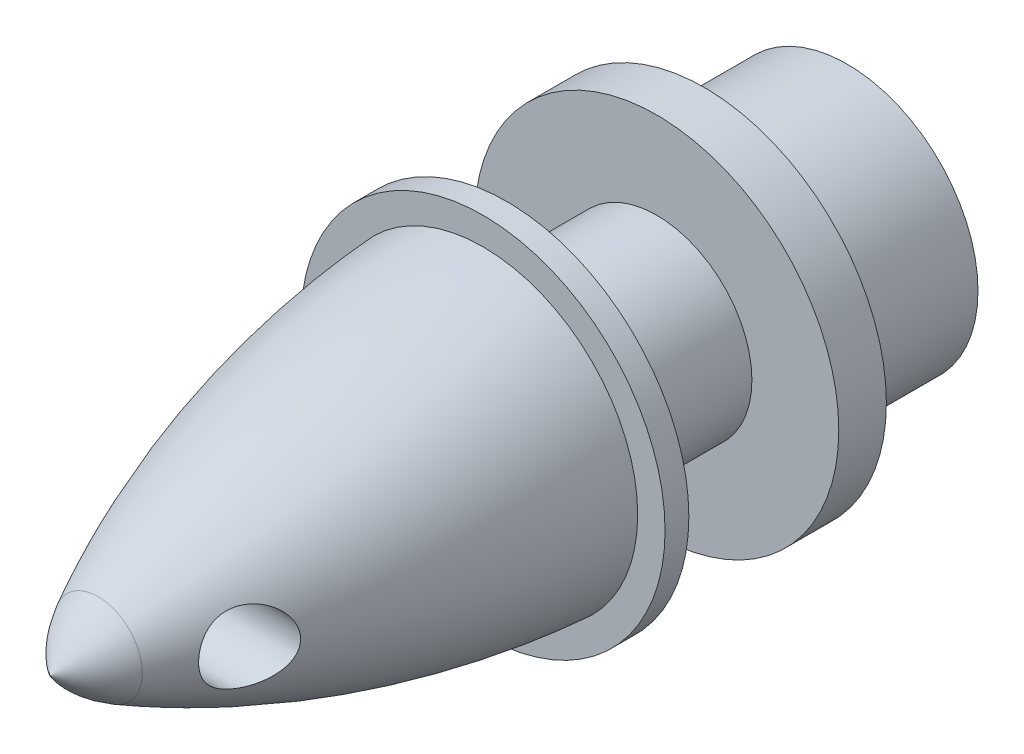
ISO-10303-21;
HEADER;
FILE_DESCRIPTION(('STEP AP214'),'2;1');
FILE_NAME('part.step','',(''),(''),'','','');
FILE_SCHEMA(('AUTOMOTIVE_DESIGN { 1 0 10303 214 1 1 1 1 }'));
ENDSEC;
DATA;
#1=APPLICATION_CONTEXT('core data for automotive mechanical design processes');
#2=APPLICATION_PROTOCOL_DEFINITION('international standard','automotive_design',2000,#1);
#3=PRODUCT_CONTEXT('',#1,'mechanical');
#4=PRODUCT('Part','Part','',(#3));
#5=PRODUCT_RELATED_PRODUCT_CATEGORY('part','',(#4));
#6=PRODUCT_DEFINITION_FORMATION('','',#4);
#7=PRODUCT_DEFINITION_CONTEXT('part definition',#1,'design');
#8=PRODUCT_DEFINITION('design','',#6,#7);
#9=PRODUCT_DEFINITION_SHAPE('','',#8);
#10=(LENGTH_UNIT() NAMED_UNIT(*) SI_UNIT(.MILLI.,.METRE.));
#11=(NAMED_UNIT(*) PLANE_ANGLE_UNIT() SI_UNIT($,.RADIAN.));
#12=(NAMED_UNIT(*) SI_UNIT($,.STERADIAN.) SOLID_ANGLE_UNIT());
#13=UNCERTAINTY_MEASURE_WITH_UNIT(LENGTH_MEASURE(1.E-05),#10,'distance_accuracy_value','');
#14=(GEOMETRIC_REPRESENTATION_CONTEXT(3) GLOBAL_UNCERTAINTY_ASSIGNED_CONTEXT((#13)) GLOBAL_UNIT_ASSIGNED_CONTEXT((#10,
#11,#12)) REPRESENTATION_CONTEXT('',''));
#15=CARTESIAN_POINT('',(0.,0.,0.));
#16=DIRECTION('',(0.,0.,1.));
#17=DIRECTION('',(1.,0.,0.));
#18=AXIS2_PLACEMENT_3D('',#15,#16,#17);
#19=CARTESIAN_POINT('',(-3.,0.,12.1402277713536));
#20=DIRECTION('',(0.,-1.,0.));
#21=DIRECTION('',(1.,0.,0.));
#22=AXIS2_PLACEMENT_3D('',#19,#20,#21);
#23=CIRCLE('',#22,5.5);
#24=TRIMMED_CURVE('',#23,(PARAMETER_VALUE(-0.993864981558439)),
(PARAMETER_VALUE(0.993864981558439)),.T.,.PARAMETER.);
#25=CARTESIAN_POINT('',(0.,0.,12.1402277713536));
#26=DIRECTION('',(0.,0.,1.));
#27=AXIS1_PLACEMENT('',#25,#26);
#28=SURFACE_OF_REVOLUTION('',#24,#27);
#29=CARTESIAN_POINT('',(0.,0.,16.75));
#30=VERTEX_POINT('',#29);
#31=VERTEX_LOOP('',#30);
#32=FACE_BOUND('',#31,.T.);
#33=CARTESIAN_POINT('',(0.,0.,14.7233272084972));
#34=DIRECTION('',(0.,0.,1.));
#35=DIRECTION('',(1.,0.,0.));
#36=AXIS2_PLACEMENT_3D('',#33,#34,#35);
#37=CIRCLE('',#36,1.85567681150921);
#38=CARTESIAN_POINT('',(1.85567681150921,0.,14.7233272084972));
#39=VERTEX_POINT('',#38);
#40=EDGE_CURVE('E11',#39,#39,#37,.T.);
#41=ORIENTED_EDGE('',*,*,#40,.T.);
#42=EDGE_LOOP('',(#41));
#43=FACE_BOUND('',#42,.T.);
#44=ADVANCED_FACE('F35',(#32,#43),#28,.T.);
#45=CARTESIAN_POINT('',(0.,0.,-4.29767773774233));
#46=DIRECTION('',(0.,0.,1.));
#47=DIRECTION('',(1.,0.,0.));
#48=AXIS2_PLACEMENT_3D('',#45,#46,#47);
#49=DEGENERATE_TOROIDAL_SURFACE('',#48,33.8997615277859,40.5,.F.);
#50=CARTESIAN_POINT('',(-3.83034929221141,-0.631541586660031,10.2894283464427));
#51=CARTESIAN_POINT('',(-3.85143952273451,-0.570672683220179,10.2611763089974));
#52=CARTESIAN_POINT('',(-3.86989224051546,-0.507122725607407,10.2366537173003));
#53=CARTESIAN_POINT('',(-3.90042645832149,-0.375845511399598,10.1962280268149));
#54=CARTESIAN_POINT('',(-3.91250825062599,-0.308118446597261,10.1803245326067));
#55=CARTESIAN_POINT('',(-3.92948372047723,-0.169949209156696,10.1580118547172));
#56=CARTESIAN_POINT('',(-3.93435066094763,-0.0994979252108073,10.1516379855454));
#57=CARTESIAN_POINT('',(-3.93642523613772,0.0417032275088749,10.1489187705136));
#58=CARTESIAN_POINT('',(-3.93363435637182,0.112453035714549,10.152571479632));
#59=CARTESIAN_POINT('',(-3.92091880482957,0.248865646072327,10.1692649127013));
#60=CARTESIAN_POINT('',(-3.91132300015463,0.314613708351748,10.1818728912772));
#61=CARTESIAN_POINT('',(-3.88600647401792,0.442738806364672,10.2152979421072));
#62=CARTESIAN_POINT('',(-3.87028420247205,0.505114984411245,10.2361170919217));
#63=CARTESIAN_POINT('',(-3.83258987861195,0.628663684945975,10.2863733390065));
#64=CARTESIAN_POINT('',(-3.81031671271832,0.689572404029732,10.3162283559207));
#65=CARTESIAN_POINT('',(-3.76111263800261,0.805430578032693,10.3828168021825));
#66=CARTESIAN_POINT('',(-3.7341795547332,0.860377231321946,10.4195534433523));
#67=CARTESIAN_POINT('',(-3.67198392315347,0.972483019063366,10.5054220657219));
#68=CARTESIAN_POINT('',(-3.63608130261267,1.02848384216901,10.5555994816793));
#69=CARTESIAN_POINT('',(-3.56105196490299,1.13143088982405,10.6623898652515));
#70=CARTESIAN_POINT('',(-3.52192331745678,1.17837163637791,10.7190066936586));
#71=CARTESIAN_POINT('',(-3.43390110720227,1.27144147401707,10.8493397208757));
#72=CARTESIAN_POINT('',(-3.38460861200144,1.31556782784547,10.9242215045879));
#73=CARTESIAN_POINT('',(-3.28557287666364,1.39030144153474,11.0802973035003));
#74=CARTESIAN_POINT('',(-3.23582912043691,1.42089048084012,11.1614996541664));
#75=CARTESIAN_POINT('',(-3.13244570670288,1.47055978389585,11.3387389669955));
#76=CARTESIAN_POINT('',(-3.07902399627282,1.48789215928985,11.4354038128141));
#77=CARTESIAN_POINT('',(-2.97784381126411,1.50316354366147,11.6331098754129));
#78=CARTESIAN_POINT('',(-2.93007511663219,1.50113810903036,11.7341427292247));
#79=CARTESIAN_POINT('',(-2.85523939960039,1.47912107896708,11.9105198726158));
#80=CARTESIAN_POINT('',(-2.82604107814951,1.46403311319761,11.9855760714478));
#81=CARTESIAN_POINT('',(-2.77391645839891,1.4217248943525,12.1344243876945));
#82=CARTESIAN_POINT('',(-2.75098351273744,1.39451758079328,12.2082177663631));
#83=CARTESIAN_POINT('',(-2.71198918457917,1.32779505922188,12.3523431996062));
#84=CARTESIAN_POINT('',(-2.69595385564735,1.28823414329281,12.42266125775));
#85=CARTESIAN_POINT('',(-2.67059327723959,1.19759936832161,12.5568123955501));
#86=CARTESIAN_POINT('',(-2.66126988195264,1.14652233303524,12.6206436790388));
#87=CARTESIAN_POINT('',(-2.64843361231305,1.03751902183787,12.7360487241476));
#88=CARTESIAN_POINT('',(-2.64462310528447,0.98014039582493,12.7881103149015));
#89=CARTESIAN_POINT('',(-2.64029305502329,0.857977972759712,12.8828221733981));
#90=CARTESIAN_POINT('',(-2.63977413210571,0.793192782246074,12.9254706657351));
#91=CARTESIAN_POINT('',(-2.64043796577988,0.654384346289103,13.0021776929999));
#92=CARTESIAN_POINT('',(-2.64170868921404,0.580058719539163,13.0356884539158));
#93=CARTESIAN_POINT('',(-2.64452177556107,0.426969609456488,13.0902439488619));
#94=CARTESIAN_POINT('',(-2.64606416730575,0.348205655693509,13.1112873587117));
#95=CARTESIAN_POINT('',(-2.64838535478499,0.185340679868619,13.1408876084757));
#96=CARTESIAN_POINT('',(-2.6491339538097,0.101149922985586,13.1489563230467));
#97=CARTESIAN_POINT('',(-2.64930260955076,-0.067393156901862,13.1508537510774));
#98=CARTESIAN_POINT('',(-2.64872262274843,-0.151745485108222,13.1446819980813));
#99=CARTESIAN_POINT('',(-2.64659010938182,-0.317994224683859,13.1183138925902));
#100=CARTESIAN_POINT('',(-2.64504004385447,-0.39989630293237,13.0981530157115));
#101=CARTESIAN_POINT('',(-2.64207786780103,-0.559194314270824,13.0444066034542));
#102=CARTESIAN_POINT('',(-2.64066578866774,-0.636589220338848,13.0108180219928));
#103=CARTESIAN_POINT('',(-2.6396973297652,-0.784966126874053,12.9309958406529));
#104=CARTESIAN_POINT('',(-2.640147971914,-0.855922828706263,12.8847150075272));
#105=CARTESIAN_POINT('',(-2.64501124207777,-0.98895511270433,12.7809615106947));
#106=CARTESIAN_POINT('',(-2.64942192129866,-1.051035045844,12.7234943628358));
#107=CARTESIAN_POINT('',(-2.66394197519107,-1.16249981367576,12.6014182881982));
#108=CARTESIAN_POINT('',(-2.67385786431372,-1.21223687848561,12.5371087640221));
#109=CARTESIAN_POINT('',(-2.70041808331324,-1.30018508236633,12.402322812282));
#110=CARTESIAN_POINT('',(-2.71705963561467,-1.33840096811128,12.3318489398834));
#111=CARTESIAN_POINT('',(-2.75618302554812,-1.40095891452969,12.191230607416));
#112=CARTESIAN_POINT('',(-2.77831358285881,-1.42592245360257,12.121261977269));
#113=CARTESIAN_POINT('',(-2.82813229731617,-1.46501200962803,11.9802977127933));
#114=CARTESIAN_POINT('',(-2.85582283866523,-1.47913336471948,11.9093016500472));
#115=CARTESIAN_POINT('',(-2.91768906201845,-1.49765778114473,11.7631738349169));
#116=CARTESIAN_POINT('',(-2.95217582468044,-1.50134263435056,11.6880854090796));
#117=CARTESIAN_POINT('',(-3.02475421161565,-1.49779458089967,11.539970381767));
#118=CARTESIAN_POINT('',(-3.0628472725506,-1.4905573058321,11.466944617175));
#119=CARTESIAN_POINT('',(-3.14825580211322,-1.46369830920781,11.3109978946641));
#120=CARTESIAN_POINT('',(-3.19599950763058,-1.44208716788931,11.2286529883572));
#121=CARTESIAN_POINT('',(-3.29243329698103,-1.38555413946617,11.0691271465418));
#122=CARTESIAN_POINT('',(-3.34112467482422,-1.35061263355461,10.9919540202973));
#123=CARTESIAN_POINT('',(-3.44396652617608,-1.26223203700497,10.8338755567541));
#124=CARTESIAN_POINT('',(-3.49795351288472,-1.20691744007376,10.7539018307124));
#125=CARTESIAN_POINT('',(-3.60123737847307,-1.08010982752728,10.6045764849589));
#126=CARTESIAN_POINT('',(-3.65054543423108,-1.00865681886975,10.5351992976172));
#127=CARTESIAN_POINT('',(-3.72129890164677,-0.884613267128606,10.4372627824443));
#128=CARTESIAN_POINT('',(-3.74556355344497,-0.83725357232222,10.404037516603));
#129=CARTESIAN_POINT('',(-3.79069832033003,-0.737817438553492,10.3426996076501));
#130=CARTESIAN_POINT('',(-3.8115694544584,-0.685742422898023,10.3145854294264));
#131=CARTESIAN_POINT('',(-3.83034929221141,-0.631541586660031,10.2894283464427));
#132=B_SPLINE_CURVE_WITH_KNOTS('',3,(#50,#51,#52,#53,#54,#55,#56,#57,#58,#59,#60,#61,#62,#63,
#64,#65,#66,#67,#68,#69,#70,#71,#72,#73,#74,#75,#76,#77,#78,#79,#80,#81,#82,#83,#84,#85,#86,#87,
#88,#89,#90,#91,#92,#93,#94,#95,#96,#97,#98,#99,#100,#101,#102,#103,#104,#105,#106,#107,#108,
#109,#110,#111,#112,#113,#114,#115,#116,#117,#118,#119,#120,#121,#122,#123,#124,#125,#126,#127,
#128,#129,#130,#131),.UNSPECIFIED.,.T.,.F.,(4,2,2,2,2,2,2,2,2,2,2,2,2,2,2,2,2,2,2,2,2,2,2,2,2,2,
2,2,2,2,2,2,2,2,2,2,2,2,2,2,4),(0.,0.210840777507814,0.421671881416407,0.63328235503967,
0.84485178197166,1.04683770999671,1.24887477657995,1.4622453194832,1.67571569688447,
1.92477457408447,2.17398357127001,2.47255861045609,2.7715343036593,3.10521149104471,
3.4382758987239,3.6830719250217,3.92760721301763,4.17305821365269,4.41857699476687,
4.65027035472311,4.88200737712329,5.12554072858705,5.36909994153874,5.62162424612142,
5.87415682241969,6.12605132000641,6.37800299246778,6.63090531404759,6.88368324674871,
7.12809311824062,7.37240215591732,7.60392371506785,7.83554476688979,8.08275804677646,
8.33007022821356,8.6217647982818,8.91389033292468,9.24594402464888,9.57718342166889,
9.76498351089078,9.95272710093728),.UNSPECIFIED.);
#133=CARTESIAN_POINT('',(-3.83034929221141,-0.631541586660031,10.2894283464427));
#134=VERTEX_POINT('',#133);
#135=EDGE_CURVE('E38',#134,#134,#132,.T.);
#136=ORIENTED_EDGE('',*,*,#135,.T.);
#137=EDGE_LOOP('',(#136));
#138=FACE_BOUND('',#137,.T.);
#139=CARTESIAN_POINT('',(3.58693305302596,-1.09570510945913,10.6255829313071));
#140=CARTESIAN_POINT('',(3.52867692975946,-1.17350605438976,10.7087995529405));
#141=CARTESIAN_POINT('',(3.46666607242014,-1.2406925710528,10.7996521550121));
#142=CARTESIAN_POINT('',(3.34011630273317,-1.35310950170611,10.9929688610874));
#143=CARTESIAN_POINT('',(3.27556699246153,-1.39823656029574,11.09548490198));
#144=CARTESIAN_POINT('',(3.15828931634142,-1.46007678993781,11.2932917756658));
#145=CARTESIAN_POINT('',(3.10523382722912,-1.48002405767622,11.3873796277138));
#146=CARTESIAN_POINT('',(3.00407917345641,-1.50148019989616,11.5800056030077));
#147=CARTESIAN_POINT('',(2.95596433785177,-1.50304927808663,11.6785281336311));
#148=CARTESIAN_POINT('',(2.87854414550442,-1.4880501416394,11.8536324562089));
#149=CARTESIAN_POINT('',(2.84749516128953,-1.47574138050641,11.9298096710108));
#150=CARTESIAN_POINT('',(2.79157018187521,-1.43872696218467,12.081438737756));
#151=CARTESIAN_POINT('',(2.76668974407978,-1.41403026578644,12.1568910738903));
#152=CARTESIAN_POINT('',(2.72391291317071,-1.35187386729263,12.3049068445677));
#153=CARTESIAN_POINT('',(2.70604777135227,-1.31435841675801,12.3774560875466));
#154=CARTESIAN_POINT('',(2.67740792684267,-1.22720273516431,12.5164281336259));
#155=CARTESIAN_POINT('',(2.66663379345782,-1.17756153101966,12.5828504444535));
#156=CARTESIAN_POINT('',(2.65157643270323,-1.07151805581955,12.7025145946036));
#157=CARTESIAN_POINT('',(2.64688668618977,-1.01584599842121,12.7563573953227));
#158=CARTESIAN_POINT('',(2.64113374941341,-0.896767130537196,12.854900058929));
#159=CARTESIAN_POINT('',(2.64007128650827,-0.833358771376566,12.8995980863799));
#160=CARTESIAN_POINT('',(2.6399497778778,-0.697494881687438,12.9804210282345));
#161=CARTESIAN_POINT('',(2.64098068108844,-0.624764462368605,13.0160837305561));
#162=CARTESIAN_POINT('',(2.64359311909436,-0.47452554896773,13.0752531304433));
#163=CARTESIAN_POINT('',(2.64517472237579,-0.39701646158818,13.098758315172));
#164=CARTESIAN_POINT('',(2.6477687031776,-0.235848479293578,13.1337309807414));
#165=CARTESIAN_POINT('',(2.64875403858807,-0.152068214144697,13.144644537684));
#166=CARTESIAN_POINT('',(2.64942673739907,0.0161407122979991,13.1522744993074));
#167=CARTESIAN_POINT('',(2.64911407588738,0.100569386005565,13.1489906314994));
#168=CARTESIAN_POINT('',(2.64738040323371,0.26755642701058,13.1283375999897));
#169=CARTESIAN_POINT('',(2.64596088464308,0.350117158996376,13.1109874029046));
#170=CARTESIAN_POINT('',(2.6429784125418,0.511186509352488,13.0627133455279));
#171=CARTESIAN_POINT('',(2.64141542636903,0.589694198611276,13.0317863882323));
#172=CARTESIAN_POINT('',(2.63975615907714,0.740721247030466,12.957078582015));
#173=CARTESIAN_POINT('',(2.63966522425565,0.813217827129501,12.9132514676333));
#174=CARTESIAN_POINT('',(2.64301267409236,0.949755913922115,12.8140770213547));
#175=CARTESIAN_POINT('',(2.64644969264998,1.01380068250812,12.7587341552218));
#176=CARTESIAN_POINT('',(2.65873540433593,1.12986470585747,12.6400044999095));
#177=CARTESIAN_POINT('',(2.66743599971854,1.18216115967415,12.5768742110663));
#178=CARTESIAN_POINT('',(2.69148778230666,1.27530974768428,12.4438339991507));
#179=CARTESIAN_POINT('',(2.70683549400298,1.31616784417843,12.3739276338215));
#180=CARTESIAN_POINT('',(2.74349058120278,1.38362976729202,12.2341673156962));
#181=CARTESIAN_POINT('',(2.76441003708403,1.41091128776947,12.164535813382));
#182=CARTESIAN_POINT('',(2.8120054488632,1.4545355031279,12.0238417506566));
#183=CARTESIAN_POINT('',(2.83868368951093,1.47087384580828,11.9527786324388));
#184=CARTESIAN_POINT('',(2.89826804566919,1.4936357906509,11.8073265847188));
#185=CARTESIAN_POINT('',(2.93142475362756,1.49950339993347,11.7329555611919));
#186=CARTESIAN_POINT('',(3.00154646005666,1.50043675803059,11.5859931639095));
#187=CARTESIAN_POINT('',(3.03851306308257,1.49549793780609,11.5134025560489));
#188=CARTESIAN_POINT('',(3.12151710782987,1.47383049395026,11.3585251374412));
#189=CARTESIAN_POINT('',(3.16801335724834,1.45519913043244,11.2767502422587));
#190=CARTESIAN_POINT('',(3.26230679753115,1.40496221857788,11.118000026849));
#191=CARTESIAN_POINT('',(3.31010547642969,1.37334119479385,11.0410305580803));
#192=CARTESIAN_POINT('',(3.41212812949664,1.29198835378337,10.8819535768514));
#193=CARTESIAN_POINT('',(3.46624824358509,1.24025999045709,10.8007894102556));
#194=CARTESIAN_POINT('',(3.5705612673437,1.1207463271548,10.6483596475598));
#195=CARTESIAN_POINT('',(3.62075854228998,1.05297922329138,10.5770829782902));
#196=CARTESIAN_POINT('',(3.70245972040541,0.920311217991677,10.4631131813946));
#197=CARTESIAN_POINT('',(3.73553943937933,0.858728945066755,10.4176858074907));
#198=CARTESIAN_POINT('',(3.79576502121588,0.727214539172898,10.3357904286411));
#199=CARTESIAN_POINT('',(3.82291472339267,0.657287854313697,10.2993166249133));
#200=CARTESIAN_POINT('',(3.86964517893193,0.509627903038312,10.2369344696162));
#201=CARTESIAN_POINT('',(3.88915562496871,0.4318300514773,10.2111241443089));
#202=CARTESIAN_POINT('',(3.9184796846242,0.271337273423093,10.1724472575882));
#203=CARTESIAN_POINT('',(3.92830454472361,0.188648145063095,10.1595656835563));
#204=CARTESIAN_POINT('',(3.93659919389744,0.0340903917417208,10.1486896822151));
#205=CARTESIAN_POINT('',(3.93653240239323,-0.0375715557330618,10.1487766420187));
#206=CARTESIAN_POINT('',(3.92865850867555,-0.179709912254658,10.1591022430478));
#207=CARTESIAN_POINT('',(3.92085344863267,-0.250186629099851,10.1693382058971));
#208=CARTESIAN_POINT('',(3.89871123018015,-0.384236372891603,10.1985089774238));
#209=CARTESIAN_POINT('',(3.88473751127781,-0.447977658872443,10.2169602243808));
#210=CARTESIAN_POINT('',(3.85123952317005,-0.571207524093798,10.2614690132661));
#211=CARTESIAN_POINT('',(3.83171187095316,-0.630693483606082,10.2875311914242));
#212=CARTESIAN_POINT('',(3.78586763729112,-0.750313527923378,10.3492258244767));
#213=CARTESIAN_POINT('',(3.75906097551858,-0.809891644466094,10.3855644724465));
#214=CARTESIAN_POINT('',(3.7012480731392,-0.92205870065022,10.4648747495773));
#215=CARTESIAN_POINT('',(3.6702460668294,-0.974654582669289,10.507839696945));
#216=CARTESIAN_POINT('',(3.62118516941553,-1.04858455517783,10.576855314261));
#217=CARTESIAN_POINT('',(3.60422450879786,-1.07261240224058,10.6008827547114));
#218=CARTESIAN_POINT('',(3.58693305302596,-1.09570510945913,10.6255829313071));
#219=B_SPLINE_CURVE_WITH_KNOTS('',3,(#139,#140,#141,#142,#143,#144,#145,#146,#147,#148,#149,
#150,#151,#152,#153,#154,#155,#156,#157,#158,#159,#160,#161,#162,#163,#164,#165,#166,#167,#168,
#169,#170,#171,#172,#173,#174,#175,#176,#177,#178,#179,#180,#181,#182,#183,#184,#185,#186,#187,
#188,#189,#190,#191,#192,#193,#194,#195,#196,#197,#198,#199,#200,#201,#202,#203,#204,#205,#206,
#207,#208,#209,#210,#211,#212,#213,#214,#215,#216,#217,#218),.UNSPECIFIED.,.T.,.F.,(4,2,2,2,2,2,
2,2,2,2,2,2,2,2,2,2,2,2,2,2,2,2,2,2,2,2,2,2,2,2,2,2,2,2,2,2,2,2,2,4),(0.,0.383710311389409,
0.769201592367,1.09719557564175,1.42411480679135,1.6726320549619,1.9209697973065,
2.17040159833618,2.41985342272115,2.65159531285204,2.88338367008644,3.12534215600864,
3.36733074311873,3.6196015217974,3.87187714228795,4.12381316652054,4.3758066899356,
4.62871521631047,4.88152584791167,5.12753421847168,5.37341411616303,5.60533137718057,
5.83734081910484,6.0813397547409,6.32544187488193,6.6120381685829,6.89897689836161,
7.22867135595417,7.55799354985472,7.80714234978367,8.05612936016274,8.30735687233306,
8.55829232524358,8.77214657255209,8.98594439759579,9.18854716572679,9.39127360851929,
9.61473428000043,9.83797107514591,9.95186313501166),.UNSPECIFIED.);
#220=CARTESIAN_POINT('',(3.58693305302596,-1.09570510945913,10.6255829313071));
#221=VERTEX_POINT('',#220);
#222=EDGE_CURVE('E67',#221,#221,#219,.T.);
#223=ORIENTED_EDGE('',*,*,#222,.T.);
#224=EDGE_LOOP('',(#223));
#225=FACE_BOUND('',#224,.T.);
#226=ORIENTED_EDGE('',*,*,#40,.F.);
#227=EDGE_LOOP('',(#226));
#228=FACE_BOUND('',#227,.T.);
#229=CARTESIAN_POINT('',(0.,0.,-1.45));
#230=DIRECTION('',(0.,0.,1.));
#231=DIRECTION('',(1.,0.,0.));
#232=AXIS2_PLACEMENT_3D('',#229,#230,#231);
#233=CIRCLE('',#232,6.5);
#234=CARTESIAN_POINT('',(6.5,0.,-1.45));
#235=VERTEX_POINT('',#234);
#236=EDGE_CURVE('E45',#235,#235,#233,.T.);
#237=ORIENTED_EDGE('',*,*,#236,.T.);
#238=EDGE_LOOP('',(#237));
#239=FACE_BOUND('',#238,.T.);
#240=ADVANCED_FACE('F51',(#138,#225,#228,#239),#49,.F.);
#241=CARTESIAN_POINT('',(0.,7.65,-1.45));
#242=DIRECTION('',(0.,0.,-1.));
#243=DIRECTION('',(-1.,0.,0.));
#244=AXIS2_PLACEMENT_3D('',#241,#242,#243);
#245=PLANE('',#244);
#246=ORIENTED_EDGE('',*,*,#236,.F.);
#247=EDGE_LOOP('',(#246));
#248=FACE_BOUND('',#247,.T.);
#249=CARTESIAN_POINT('',(0.,0.,-1.45));
#250=DIRECTION('',(0.,0.,1.));
#251=DIRECTION('',(1.,0.,0.));
#252=AXIS2_PLACEMENT_3D('',#249,#250,#251);
#253=CIRCLE('',#252,7.65);
#254=CARTESIAN_POINT('',(7.65,0.,-1.45));
#255=VERTEX_POINT('',#254);
#256=EDGE_CURVE('E61',#255,#255,#253,.T.);
#257=ORIENTED_EDGE('',*,*,#256,.T.);
#258=EDGE_LOOP('',(#257));
#259=FACE_BOUND('',#258,.T.);
#260=ADVANCED_FACE('F56',(#248,#259),#245,.F.);
#261=CARTESIAN_POINT('',(0.,0.,-16.75));
#262=DIRECTION('',(0.,0.,1.));
#263=DIRECTION('',(1.,0.,0.));
#264=AXIS2_PLACEMENT_3D('',#261,#262,#263);
#265=CYLINDRICAL_SURFACE('',#264,7.65);
#266=ORIENTED_EDGE('',*,*,#256,.F.);
#267=EDGE_LOOP('',(#266));
#268=FACE_BOUND('',#267,.T.);
#269=CARTESIAN_POINT('',(0.,0.,-2.45));
#270=DIRECTION('',(0.,0.,1.));
#271=DIRECTION('',(1.,0.,0.));
#272=AXIS2_PLACEMENT_3D('',#269,#270,#271);
#273=CIRCLE('',#272,7.65);
#274=CARTESIAN_POINT('',(7.65,0.,-2.45));
#275=VERTEX_POINT('',#274);
#276=EDGE_CURVE('E64',#275,#275,#273,.T.);
#277=ORIENTED_EDGE('',*,*,#276,.T.);
#278=EDGE_LOOP('',(#277));
#279=FACE_BOUND('',#278,.T.);
#280=ADVANCED_FACE('F106',(#268,#279),#265,.T.);
#281=CARTESIAN_POINT('',(0.,4.,-2.45));
#282=DIRECTION('',(0.,0.,1.));
#283=DIRECTION('',(1.,0.,0.));
#284=AXIS2_PLACEMENT_3D('',#281,#282,#283);
#285=PLANE('',#284);
#286=ORIENTED_EDGE('',*,*,#276,.F.);
#287=EDGE_LOOP('',(#286));
#288=FACE_BOUND('',#287,.T.);
#289=CARTESIAN_POINT('',(0.,0.,-2.45));
#290=DIRECTION('',(0.,0.,1.));
#291=DIRECTION('',(1.,0.,0.));
#292=AXIS2_PLACEMENT_3D('',#289,#290,#291);
#293=CIRCLE('',#292,4.);
#294=CARTESIAN_POINT('',(4.,0.,-2.45));
#295=VERTEX_POINT('',#294);
#296=EDGE_CURVE('E118',#295,#295,#293,.T.);
#297=ORIENTED_EDGE('',*,*,#296,.T.);
#298=EDGE_LOOP('',(#297));
#299=FACE_BOUND('',#298,.T.);
#300=ADVANCED_FACE('F102',(#288,#299),#285,.F.);
#301=CARTESIAN_POINT('',(0.,0.,-16.75));
#302=DIRECTION('',(0.,0.,1.));
#303=DIRECTION('',(1.,0.,0.));
#304=AXIS2_PLACEMENT_3D('',#301,#302,#303);
#305=CYLINDRICAL_SURFACE('',#304,4.);
#306=ORIENTED_EDGE('',*,*,#296,.F.);
#307=EDGE_LOOP('',(#306));
#308=FACE_BOUND('',#307,.T.);
#309=CARTESIAN_POINT('',(0.,0.,-8.75));
#310=DIRECTION('',(0.,0.,1.));
#311=DIRECTION('',(1.,0.,0.));
#312=AXIS2_PLACEMENT_3D('',#309,#310,#311);
#313=CIRCLE('',#312,4.);
#314=CARTESIAN_POINT('',(4.,0.,-8.75));
#315=VERTEX_POINT('',#314);
#316=EDGE_CURVE('E120',#315,#315,#313,.T.);
#317=ORIENTED_EDGE('',*,*,#316,.T.);
#318=EDGE_LOOP('',(#317));
#319=FACE_BOUND('',#318,.T.);
#320=ADVANCED_FACE('F98',(#308,#319),#305,.T.);
#321=CARTESIAN_POINT('',(0.,7.65,-8.75));
#322=DIRECTION('',(0.,0.,-1.));
#323=DIRECTION('',(-1.,0.,0.));
#324=AXIS2_PLACEMENT_3D('',#321,#322,#323);
#325=PLANE('',#324);
#326=ORIENTED_EDGE('',*,*,#316,.F.);
#327=EDGE_LOOP('',(#326));
#328=FACE_BOUND('',#327,.T.);
#329=CARTESIAN_POINT('',(0.,0.,-8.75));
#330=DIRECTION('',(0.,0.,1.));
#331=DIRECTION('',(1.,0.,0.));
#332=AXIS2_PLACEMENT_3D('',#329,#330,#331);
#333=CIRCLE('',#332,7.65);
#334=CARTESIAN_POINT('',(7.65,0.,-8.75));
#335=VERTEX_POINT('',#334);
#336=EDGE_CURVE('E125',#335,#335,#333,.T.);
#337=ORIENTED_EDGE('',*,*,#336,.T.);
#338=EDGE_LOOP('',(#337));
#339=FACE_BOUND('',#338,.T.);
#340=ADVANCED_FACE('F94',(#328,#339),#325,.F.);
#341=CARTESIAN_POINT('',(0.,0.,-16.75));
#342=DIRECTION('',(0.,0.,1.));
#343=DIRECTION('',(1.,0.,0.));
#344=AXIS2_PLACEMENT_3D('',#341,#342,#343);
#345=CYLINDRICAL_SURFACE('',#344,7.65);
#346=ORIENTED_EDGE('',*,*,#336,.F.);
#347=EDGE_LOOP('',(#346));
#348=FACE_BOUND('',#347,.T.);
#349=CARTESIAN_POINT('',(0.,0.,-10.75));
#350=DIRECTION('',(0.,0.,1.));
#351=DIRECTION('',(1.,0.,0.));
#352=AXIS2_PLACEMENT_3D('',#349,#350,#351);
#353=CIRCLE('',#352,7.65);
#354=CARTESIAN_POINT('',(7.65,0.,-10.75));
#355=VERTEX_POINT('',#354);
#356=EDGE_CURVE('E128',#355,#355,#353,.T.);
#357=ORIENTED_EDGE('',*,*,#356,.T.);
#358=EDGE_LOOP('',(#357));
#359=FACE_BOUND('',#358,.T.);
#360=ADVANCED_FACE('F90',(#348,#359),#345,.T.);
#361=CARTESIAN_POINT('',(0.,0.,-11.95));
#362=DIRECTION('',(0.,0.,1.));
#363=DIRECTION('',(1.,0.,0.));
#364=AXIS2_PLACEMENT_3D('',#361,#362,#363);
#365=CONICAL_SURFACE('',#364,5.5,1.06172543837251);
#366=ORIENTED_EDGE('',*,*,#356,.F.);
#367=EDGE_LOOP('',(#366));
#368=FACE_BOUND('',#367,.T.);
#369=CARTESIAN_POINT('',(0.,0.,-11.95));
#370=DIRECTION('',(0.,0.,1.));
#371=DIRECTION('',(1.,0.,0.));
#372=AXIS2_PLACEMENT_3D('',#369,#370,#371);
#373=CIRCLE('',#372,5.5);
#374=CARTESIAN_POINT('',(5.5,0.,-11.95));
#375=VERTEX_POINT('',#374);
#376=EDGE_CURVE('E131',#375,#375,#373,.T.);
#377=ORIENTED_EDGE('',*,*,#376,.T.);
#378=EDGE_LOOP('',(#377));
#379=FACE_BOUND('',#378,.T.);
#380=ADVANCED_FACE('F86',(#368,#379),#365,.T.);
#381=CARTESIAN_POINT('',(0.,0.,-16.75));
#382=DIRECTION('',(0.,0.,1.));
#383=DIRECTION('',(1.,0.,0.));
#384=AXIS2_PLACEMENT_3D('',#381,#382,#383);
#385=CYLINDRICAL_SURFACE('',#384,5.5);
#386=ORIENTED_EDGE('',*,*,#376,.F.);
#387=EDGE_LOOP('',(#386));
#388=FACE_BOUND('',#387,.T.);
#389=CARTESIAN_POINT('',(0.,0.,-16.75));
#390=DIRECTION('',(0.,0.,1.));
#391=DIRECTION('',(1.,0.,0.));
#392=AXIS2_PLACEMENT_3D('',#389,#390,#391);
#393=CIRCLE('',#392,5.5);
#394=CARTESIAN_POINT('',(5.5,0.,-16.75));
#395=VERTEX_POINT('',#394);
#396=EDGE_CURVE('E134',#395,#395,#393,.T.);
#397=ORIENTED_EDGE('',*,*,#396,.T.);
#398=EDGE_LOOP('',(#397));
#399=FACE_BOUND('',#398,.T.);
#400=ADVANCED_FACE('F82',(#388,#399),#385,.T.);
#401=CARTESIAN_POINT('',(0.,0.,-16.75));
#402=DIRECTION('',(0.,0.,1.));
#403=DIRECTION('',(1.,0.,0.));
#404=AXIS2_PLACEMENT_3D('',#401,#402,#403);
#405=PLANE('',#404);
#406=ORIENTED_EDGE('',*,*,#396,.F.);
#407=EDGE_LOOP('',(#406));
#408=FACE_BOUND('',#407,.T.);
#409=ADVANCED_FACE('F77',(#408),#405,.F.);
#410=CARTESIAN_POINT('',(-7.65,0.,11.65));
#411=DIRECTION('',(1.,0.,0.));
#412=DIRECTION('',(0.,0.,-1.));
#413=AXIS2_PLACEMENT_3D('',#410,#411,#412);
#414=CYLINDRICAL_SURFACE('',#413,1.5);
#415=ORIENTED_EDGE('',*,*,#222,.F.);
#416=EDGE_LOOP('',(#415));
#417=FACE_BOUND('',#416,.T.);
#418=ORIENTED_EDGE('',*,*,#135,.F.);
#419=EDGE_LOOP('',(#418));
#420=FACE_BOUND('',#419,.T.);
#421=ADVANCED_FACE('F73',(#417,#420),#414,.F.);
#422=CLOSED_SHELL('',(#44,#240,#260,#280,#300,#320,#340,#360,#380,#400,#409,#421));
#423=MANIFOLD_SOLID_BREP('B2',#422);
#424=ADVANCED_BREP_SHAPE_REPRESENTATION('',(#18,#423),#14);
#425=SHAPE_DEFINITION_REPRESENTATION(#9,#424);
ENDSEC;
END-ISO-10303-21;
